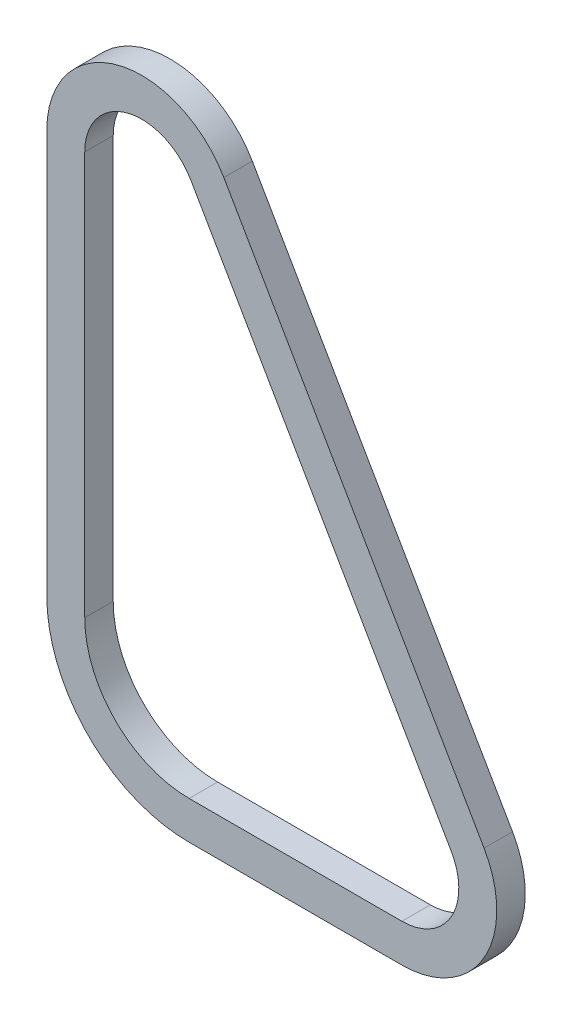
ISO-10303-21;
HEADER;
FILE_DESCRIPTION(('STEP AP214'),'2;1');
FILE_NAME('part.step','',(''),(''),'','','');
FILE_SCHEMA(('AUTOMOTIVE_DESIGN { 1 0 10303 214 1 1 1 1 }'));
ENDSEC;
DATA;
#1=APPLICATION_CONTEXT('core data for automotive mechanical design processes');
#2=APPLICATION_PROTOCOL_DEFINITION('international standard','automotive_design',2000,#1);
#3=PRODUCT_CONTEXT('',#1,'mechanical');
#4=PRODUCT('Part','Part','',(#3));
#5=PRODUCT_RELATED_PRODUCT_CATEGORY('part','',(#4));
#6=PRODUCT_DEFINITION_FORMATION('','',#4);
#7=PRODUCT_DEFINITION_CONTEXT('part definition',#1,'design');
#8=PRODUCT_DEFINITION('design','',#6,#7);
#9=PRODUCT_DEFINITION_SHAPE('','',#8);
#10=(LENGTH_UNIT() NAMED_UNIT(*) SI_UNIT(.MILLI.,.METRE.));
#11=(NAMED_UNIT(*) PLANE_ANGLE_UNIT() SI_UNIT($,.RADIAN.));
#12=(NAMED_UNIT(*) SI_UNIT($,.STERADIAN.) SOLID_ANGLE_UNIT());
#13=UNCERTAINTY_MEASURE_WITH_UNIT(LENGTH_MEASURE(1.E-05),#10,'distance_accuracy_value','');
#14=(GEOMETRIC_REPRESENTATION_CONTEXT(3) GLOBAL_UNCERTAINTY_ASSIGNED_CONTEXT((#13)) GLOBAL_UNIT_ASSIGNED_CONTEXT((#10,
#11,#12)) REPRESENTATION_CONTEXT('',''));
#15=CARTESIAN_POINT('',(0.,0.,0.));
#16=DIRECTION('',(0.,0.,1.));
#17=DIRECTION('',(1.,0.,0.));
#18=AXIS2_PLACEMENT_3D('',#15,#16,#17);
#19=CARTESIAN_POINT('',(-50.,0.,-30.));
#20=DIRECTION('',(-1.,0.,0.));
#21=DIRECTION('',(0.,-1.,0.));
#22=AXIS2_PLACEMENT_3D('',#19,#20,#21);
#23=PLANE('',#22);
#24=DIRECTION('',(0.,1.,0.));
#25=VECTOR('',#24,1.);
#26=CARTESIAN_POINT('',(-50.,0.,0.));
#27=LINE('',#26,#25);
#28=CARTESIAN_POINT('',(-50.,-425.,0.));
#29=VERTEX_POINT('',#28);
#30=CARTESIAN_POINT('',(-50.,0.,0.));
#31=VERTEX_POINT('',#30);
#32=EDGE_CURVE('E179',#29,#31,#27,.T.);
#33=ORIENTED_EDGE('',*,*,#32,.T.);
#34=DIRECTION('',(0.,0.,1.));
#35=VECTOR('',#34,1.);
#36=CARTESIAN_POINT('',(-50.,0.,-30.));
#37=LINE('',#36,#35);
#38=CARTESIAN_POINT('',(-50.,0.,-30.));
#39=VERTEX_POINT('',#38);
#40=EDGE_CURVE('E192',#39,#31,#37,.T.);
#41=ORIENTED_EDGE('',*,*,#40,.F.);
#42=DIRECTION('',(0.,1.,0.));
#43=VECTOR('',#42,1.);
#44=CARTESIAN_POINT('',(-50.,0.,-30.));
#45=LINE('',#44,#43);
#46=CARTESIAN_POINT('',(-50.,-425.,-30.));
#47=VERTEX_POINT('',#46);
#48=EDGE_CURVE('E224',#47,#39,#45,.T.);
#49=ORIENTED_EDGE('',*,*,#48,.F.);
#50=DIRECTION('',(0.,0.,1.));
#51=VECTOR('',#50,1.);
#52=CARTESIAN_POINT('',(-50.,-425.,-30.));
#53=LINE('',#52,#51);
#54=EDGE_CURVE('E11',#47,#29,#53,.T.);
#55=ORIENTED_EDGE('',*,*,#54,.T.);
#56=EDGE_LOOP('',(#33,#41,#49,#55));
#57=FACE_BOUND('',#56,.T.);
#58=ADVANCED_FACE('F37',(#57),#23,.T.);
#59=CARTESIAN_POINT('',(100.,-425.,-30.));
#60=DIRECTION('',(0.,0.,1.));
#61=DIRECTION('',(-1.,0.,0.));
#62=AXIS2_PLACEMENT_3D('',#59,#60,#61);
#63=CYLINDRICAL_SURFACE('',#62,150.);
#64=CARTESIAN_POINT('',(100.,-425.,0.));
#65=DIRECTION('',(0.,0.,1.));
#66=DIRECTION('',(1.,0.,0.));
#67=AXIS2_PLACEMENT_3D('',#64,#65,#66);
#68=CIRCLE('',#67,150.);
#69=CARTESIAN_POINT('',(100.,-575.,0.));
#70=VERTEX_POINT('',#69);
#71=EDGE_CURVE('E182',#29,#70,#68,.T.);
#72=ORIENTED_EDGE('',*,*,#71,.F.);
#73=ORIENTED_EDGE('',*,*,#54,.F.);
#74=CARTESIAN_POINT('',(100.,-425.,-30.));
#75=DIRECTION('',(0.,0.,1.));
#76=DIRECTION('',(1.,0.,0.));
#77=AXIS2_PLACEMENT_3D('',#74,#75,#76);
#78=CIRCLE('',#77,150.);
#79=CARTESIAN_POINT('',(100.,-575.,-30.));
#80=VERTEX_POINT('',#79);
#81=EDGE_CURVE('E156',#47,#80,#78,.T.);
#82=ORIENTED_EDGE('',*,*,#81,.T.);
#83=DIRECTION('',(0.,0.,1.));
#84=VECTOR('',#83,1.);
#85=CARTESIAN_POINT('',(100.,-575.,-30.));
#86=LINE('',#85,#84);
#87=EDGE_CURVE('E47',#80,#70,#86,.T.);
#88=ORIENTED_EDGE('',*,*,#87,.T.);
#89=EDGE_LOOP('',(#72,#73,#82,#88));
#90=FACE_BOUND('',#89,.T.);
#91=ADVANCED_FACE('F240',(#90),#63,.T.);
#92=CARTESIAN_POINT('',(0.,-575.,-30.));
#93=DIRECTION('',(0.,-1.,0.));
#94=DIRECTION('',(0.,0.,1.));
#95=AXIS2_PLACEMENT_3D('',#92,#93,#94);
#96=PLANE('',#95);
#97=DIRECTION('',(-1.,0.,0.));
#98=VECTOR('',#97,1.);
#99=CARTESIAN_POINT('',(0.,-575.,0.));
#100=LINE('',#99,#98);
#101=CARTESIAN_POINT('',(324.241377865075,-575.,0.));
#102=VERTEX_POINT('',#101);
#103=EDGE_CURVE('E185',#102,#70,#100,.T.);
#104=ORIENTED_EDGE('',*,*,#103,.T.);
#105=ORIENTED_EDGE('',*,*,#87,.F.);
#106=DIRECTION('',(-1.,0.,0.));
#107=VECTOR('',#106,1.);
#108=CARTESIAN_POINT('',(0.,-575.,-30.));
#109=LINE('',#108,#107);
#110=CARTESIAN_POINT('',(324.241377865075,-575.,-30.));
#111=VERTEX_POINT('',#110);
#112=EDGE_CURVE('E154',#111,#80,#109,.T.);
#113=ORIENTED_EDGE('',*,*,#112,.F.);
#114=DIRECTION('',(0.,0.,1.));
#115=VECTOR('',#114,1.);
#116=CARTESIAN_POINT('',(324.241377865075,-575.,-30.));
#117=LINE('',#116,#115);
#118=EDGE_CURVE('E148',#111,#102,#117,.T.);
#119=ORIENTED_EDGE('',*,*,#118,.T.);
#120=EDGE_LOOP('',(#104,#105,#113,#119));
#121=FACE_BOUND('',#120,.T.);
#122=ADVANCED_FACE('F245',(#121),#96,.T.);
#123=CARTESIAN_POINT('',(324.241377865075,-475.,-30.));
#124=DIRECTION('',(0.,0.,1.));
#125=DIRECTION('',(-1.,0.,0.));
#126=AXIS2_PLACEMENT_3D('',#123,#124,#125);
#127=CYLINDRICAL_SURFACE('',#126,100.);
#128=CARTESIAN_POINT('',(324.241377865075,-475.,0.));
#129=DIRECTION('',(0.,0.,1.));
#130=DIRECTION('',(1.,0.,0.));
#131=AXIS2_PLACEMENT_3D('',#128,#129,#130);
#132=CIRCLE('',#131,100.);
#133=CARTESIAN_POINT('',(410.843918243519,-424.999999999999,0.));
#134=VERTEX_POINT('',#133);
#135=EDGE_CURVE('E187',#134,#102,#132,.F.);
#136=ORIENTED_EDGE('',*,*,#135,.T.);
#137=ORIENTED_EDGE('',*,*,#118,.F.);
#138=CARTESIAN_POINT('',(324.241377865075,-475.,-30.));
#139=DIRECTION('',(0.,0.,1.));
#140=DIRECTION('',(1.,0.,0.));
#141=AXIS2_PLACEMENT_3D('',#138,#139,#140);
#142=CIRCLE('',#141,100.);
#143=CARTESIAN_POINT('',(410.843918243519,-424.999999999999,-30.));
#144=VERTEX_POINT('',#143);
#145=EDGE_CURVE('E138',#144,#111,#142,.F.);
#146=ORIENTED_EDGE('',*,*,#145,.F.);
#147=DIRECTION('',(0.,0.,1.));
#148=VECTOR('',#147,1.);
#149=CARTESIAN_POINT('',(410.843918243519,-424.999999999999,-30.));
#150=LINE('',#149,#148);
#151=EDGE_CURVE('E143',#144,#134,#150,.T.);
#152=ORIENTED_EDGE('',*,*,#151,.T.);
#153=EDGE_LOOP('',(#136,#137,#146,#152));
#154=FACE_BOUND('',#153,.T.);
#155=ADVANCED_FACE('F151',(#154),#127,.T.);
#156=CARTESIAN_POINT('',(124.102540378443,71.6506350946115,-30.));
#157=DIRECTION('',(0.866025403784436,0.500000000000004,0.));
#158=DIRECTION('',(-0.500000000000004,0.866025403784436,0.));
#159=AXIS2_PLACEMENT_3D('',#156,#157,#158);
#160=PLANE('',#159);
#161=DIRECTION('',(0.500000000000005,-0.866025403784436,0.));
#162=VECTOR('',#161,1.);
#163=CARTESIAN_POINT('',(124.102540378443,71.6506350946115,0.));
#164=LINE('',#163,#162);
#165=CARTESIAN_POINT('',(136.602540378444,50.0000000000004,0.));
#166=VERTEX_POINT('',#165);
#167=EDGE_CURVE('E145',#166,#134,#164,.T.);
#168=ORIENTED_EDGE('',*,*,#167,.T.);
#169=ORIENTED_EDGE('',*,*,#151,.F.);
#170=DIRECTION('',(0.500000000000005,-0.866025403784436,0.));
#171=VECTOR('',#170,1.);
#172=CARTESIAN_POINT('',(124.102540378443,71.6506350946115,-30.));
#173=LINE('',#172,#171);
#174=CARTESIAN_POINT('',(136.602540378444,50.0000000000004,-30.));
#175=VERTEX_POINT('',#174);
#176=EDGE_CURVE('E134',#175,#144,#173,.T.);
#177=ORIENTED_EDGE('',*,*,#176,.F.);
#178=DIRECTION('',(0.,0.,1.));
#179=VECTOR('',#178,1.);
#180=CARTESIAN_POINT('',(136.602540378444,50.0000000000004,-30.));
#181=LINE('',#180,#179);
#182=EDGE_CURVE('E149',#175,#166,#181,.T.);
#183=ORIENTED_EDGE('',*,*,#182,.T.);
#184=EDGE_LOOP('',(#168,#169,#177,#183));
#185=FACE_BOUND('',#184,.T.);
#186=ADVANCED_FACE('F144',(#185),#160,.T.);
#187=CARTESIAN_POINT('',(-10.,0.,-30.));
#188=DIRECTION('',(-1.,0.,0.));
#189=DIRECTION('',(0.,-1.,0.));
#190=AXIS2_PLACEMENT_3D('',#187,#188,#189);
#191=PLANE('',#190);
#192=DIRECTION('',(0.,1.,0.));
#193=VECTOR('',#192,1.);
#194=CARTESIAN_POINT('',(-10.,0.,0.));
#195=LINE('',#194,#193);
#196=CARTESIAN_POINT('',(-9.99999999999998,-425.,0.));
#197=VERTEX_POINT('',#196);
#198=CARTESIAN_POINT('',(-10.,0.,0.));
#199=VERTEX_POINT('',#198);
#200=EDGE_CURVE('E162',#197,#199,#195,.T.);
#201=ORIENTED_EDGE('',*,*,#200,.F.);
#202=DIRECTION('',(0.,0.,1.));
#203=VECTOR('',#202,1.);
#204=CARTESIAN_POINT('',(-9.99999999999998,-425.,-30.));
#205=LINE('',#204,#203);
#206=CARTESIAN_POINT('',(-9.99999999999998,-425.,-30.));
#207=VERTEX_POINT('',#206);
#208=EDGE_CURVE('E161',#207,#197,#205,.T.);
#209=ORIENTED_EDGE('',*,*,#208,.F.);
#210=DIRECTION('',(0.,1.,0.));
#211=VECTOR('',#210,1.);
#212=CARTESIAN_POINT('',(-10.,0.,-30.));
#213=LINE('',#212,#211);
#214=CARTESIAN_POINT('',(-10.,0.,-30.));
#215=VERTEX_POINT('',#214);
#216=EDGE_CURVE('E191',#207,#215,#213,.T.);
#217=ORIENTED_EDGE('',*,*,#216,.T.);
#218=DIRECTION('',(0.,0.,1.));
#219=VECTOR('',#218,1.);
#220=CARTESIAN_POINT('',(-10.,0.,-30.));
#221=LINE('',#220,#219);
#222=EDGE_CURVE('E41',#215,#199,#221,.T.);
#223=ORIENTED_EDGE('',*,*,#222,.T.);
#224=EDGE_LOOP('',(#201,#209,#217,#223));
#225=FACE_BOUND('',#224,.T.);
#226=ADVANCED_FACE('F39',(#225),#191,.F.);
#227=CARTESIAN_POINT('',(50.,0.,-30.));
#228=DIRECTION('',(0.,0.,1.));
#229=DIRECTION('',(-1.,0.,0.));
#230=AXIS2_PLACEMENT_3D('',#227,#228,#229);
#231=CYLINDRICAL_SURFACE('',#230,60.);
#232=CARTESIAN_POINT('',(50.,0.,0.));
#233=DIRECTION('',(0.,0.,1.));
#234=DIRECTION('',(1.,0.,0.));
#235=AXIS2_PLACEMENT_3D('',#232,#233,#234);
#236=CIRCLE('',#235,60.);
#237=CARTESIAN_POINT('',(101.961524227066,30.0000000000003,0.));
#238=VERTEX_POINT('',#237);
#239=EDGE_CURVE('E165',#199,#238,#236,.F.);
#240=ORIENTED_EDGE('',*,*,#239,.F.);
#241=ORIENTED_EDGE('',*,*,#222,.F.);
#242=CARTESIAN_POINT('',(50.,0.,-30.));
#243=DIRECTION('',(0.,0.,1.));
#244=DIRECTION('',(1.,0.,0.));
#245=AXIS2_PLACEMENT_3D('',#242,#243,#244);
#246=CIRCLE('',#245,60.);
#247=CARTESIAN_POINT('',(101.961524227066,30.0000000000003,-30.));
#248=VERTEX_POINT('',#247);
#249=EDGE_CURVE('E107',#215,#248,#246,.F.);
#250=ORIENTED_EDGE('',*,*,#249,.T.);
#251=DIRECTION('',(0.,0.,1.));
#252=VECTOR('',#251,1.);
#253=CARTESIAN_POINT('',(101.961524227066,30.0000000000003,-30.));
#254=LINE('',#253,#252);
#255=EDGE_CURVE('E208',#248,#238,#254,.T.);
#256=ORIENTED_EDGE('',*,*,#255,.T.);
#257=EDGE_LOOP('',(#240,#241,#250,#256));
#258=FACE_BOUND('',#257,.T.);
#259=ADVANCED_FACE('F277',(#258),#231,.F.);
#260=CARTESIAN_POINT('',(89.4615242270663,51.650635094611,-30.));
#261=DIRECTION('',(0.866025403784439,0.5,0.));
#262=DIRECTION('',(-0.5,0.866025403784439,0.));
#263=AXIS2_PLACEMENT_3D('',#260,#261,#262);
#264=PLANE('',#263);
#265=DIRECTION('',(0.5,-0.866025403784439,0.));
#266=VECTOR('',#265,1.);
#267=CARTESIAN_POINT('',(89.4615242270663,51.650635094611,0.));
#268=LINE('',#267,#266);
#269=CARTESIAN_POINT('',(376.202902092139,-445.000000000001,0.));
#270=VERTEX_POINT('',#269);
#271=EDGE_CURVE('E168',#238,#270,#268,.T.);
#272=ORIENTED_EDGE('',*,*,#271,.F.);
#273=ORIENTED_EDGE('',*,*,#255,.F.);
#274=DIRECTION('',(0.5,-0.866025403784439,0.));
#275=VECTOR('',#274,1.);
#276=CARTESIAN_POINT('',(89.4615242270663,51.650635094611,-30.));
#277=LINE('',#276,#275);
#278=CARTESIAN_POINT('',(376.202902092139,-445.000000000001,-30.));
#279=VERTEX_POINT('',#278);
#280=EDGE_CURVE('E228',#248,#279,#277,.T.);
#281=ORIENTED_EDGE('',*,*,#280,.T.);
#282=DIRECTION('',(0.,0.,1.));
#283=VECTOR('',#282,1.);
#284=CARTESIAN_POINT('',(376.202902092139,-445.000000000001,-30.));
#285=LINE('',#284,#283);
#286=EDGE_CURVE('E206',#279,#270,#285,.T.);
#287=ORIENTED_EDGE('',*,*,#286,.T.);
#288=EDGE_LOOP('',(#272,#273,#281,#287));
#289=FACE_BOUND('',#288,.T.);
#290=ADVANCED_FACE('F274',(#289),#264,.F.);
#291=CARTESIAN_POINT('',(324.241377865075,-475.,-30.));
#292=DIRECTION('',(0.,0.,1.));
#293=DIRECTION('',(-1.,0.,0.));
#294=AXIS2_PLACEMENT_3D('',#291,#292,#293);
#295=CYLINDRICAL_SURFACE('',#294,59.9999999999987);
#296=CARTESIAN_POINT('',(324.241377865075,-475.,0.));
#297=DIRECTION('',(0.,0.,1.));
#298=DIRECTION('',(1.,0.,0.));
#299=AXIS2_PLACEMENT_3D('',#296,#297,#298);
#300=CIRCLE('',#299,59.9999999999987);
#301=CARTESIAN_POINT('',(324.241377865075,-535.,0.));
#302=VERTEX_POINT('',#301);
#303=EDGE_CURVE('E171',#270,#302,#300,.F.);
#304=ORIENTED_EDGE('',*,*,#303,.F.);
#305=ORIENTED_EDGE('',*,*,#286,.F.);
#306=CARTESIAN_POINT('',(324.241377865075,-475.,-30.));
#307=DIRECTION('',(0.,0.,1.));
#308=DIRECTION('',(1.,0.,0.));
#309=AXIS2_PLACEMENT_3D('',#306,#307,#308);
#310=CIRCLE('',#309,59.9999999999987);
#311=CARTESIAN_POINT('',(324.241377865075,-535.,-30.));
#312=VERTEX_POINT('',#311);
#313=EDGE_CURVE('E233',#279,#312,#310,.F.);
#314=ORIENTED_EDGE('',*,*,#313,.T.);
#315=DIRECTION('',(0.,0.,1.));
#316=VECTOR('',#315,1.);
#317=CARTESIAN_POINT('',(324.241377865075,-535.,-30.));
#318=LINE('',#317,#316);
#319=EDGE_CURVE('E203',#312,#302,#318,.T.);
#320=ORIENTED_EDGE('',*,*,#319,.T.);
#321=EDGE_LOOP('',(#304,#305,#314,#320));
#322=FACE_BOUND('',#321,.T.);
#323=ADVANCED_FACE('F270',(#322),#295,.F.);
#324=CARTESIAN_POINT('',(0.,-535.,-30.));
#325=DIRECTION('',(0.,-1.,0.));
#326=DIRECTION('',(0.,0.,1.));
#327=AXIS2_PLACEMENT_3D('',#324,#325,#326);
#328=PLANE('',#327);
#329=DIRECTION('',(-1.,0.,0.));
#330=VECTOR('',#329,1.);
#331=CARTESIAN_POINT('',(0.,-535.,0.));
#332=LINE('',#331,#330);
#333=CARTESIAN_POINT('',(100.,-535.,0.));
#334=VERTEX_POINT('',#333);
#335=EDGE_CURVE('E174',#302,#334,#332,.T.);
#336=ORIENTED_EDGE('',*,*,#335,.F.);
#337=ORIENTED_EDGE('',*,*,#319,.F.);
#338=DIRECTION('',(-1.,0.,0.));
#339=VECTOR('',#338,1.);
#340=CARTESIAN_POINT('',(0.,-535.,-30.));
#341=LINE('',#340,#339);
#342=CARTESIAN_POINT('',(100.,-535.,-30.));
#343=VERTEX_POINT('',#342);
#344=EDGE_CURVE('E225',#312,#343,#341,.T.);
#345=ORIENTED_EDGE('',*,*,#344,.T.);
#346=DIRECTION('',(0.,0.,1.));
#347=VECTOR('',#346,1.);
#348=CARTESIAN_POINT('',(100.,-535.,-30.));
#349=LINE('',#348,#347);
#350=EDGE_CURVE('E200',#343,#334,#349,.T.);
#351=ORIENTED_EDGE('',*,*,#350,.T.);
#352=EDGE_LOOP('',(#336,#337,#345,#351));
#353=FACE_BOUND('',#352,.T.);
#354=ADVANCED_FACE('F256',(#353),#328,.F.);
#355=CARTESIAN_POINT('',(100.,-425.,-30.));
#356=DIRECTION('',(0.,0.,1.));
#357=DIRECTION('',(-1.,0.,0.));
#358=AXIS2_PLACEMENT_3D('',#355,#356,#357);
#359=CYLINDRICAL_SURFACE('',#358,110.);
#360=CARTESIAN_POINT('',(100.,-425.,0.));
#361=DIRECTION('',(0.,0.,1.));
#362=DIRECTION('',(1.,0.,0.));
#363=AXIS2_PLACEMENT_3D('',#360,#361,#362);
#364=CIRCLE('',#363,110.);
#365=EDGE_CURVE('E177',#197,#334,#364,.T.);
#366=ORIENTED_EDGE('',*,*,#365,.T.);
#367=ORIENTED_EDGE('',*,*,#350,.F.);
#368=CARTESIAN_POINT('',(100.,-425.,-30.));
#369=DIRECTION('',(0.,0.,1.));
#370=DIRECTION('',(1.,0.,0.));
#371=AXIS2_PLACEMENT_3D('',#368,#369,#370);
#372=CIRCLE('',#371,110.);
#373=EDGE_CURVE('E222',#207,#343,#372,.T.);
#374=ORIENTED_EDGE('',*,*,#373,.F.);
#375=ORIENTED_EDGE('',*,*,#208,.T.);
#376=EDGE_LOOP('',(#366,#367,#374,#375));
#377=FACE_BOUND('',#376,.T.);
#378=ADVANCED_FACE('F221',(#377),#359,.F.);
#379=CARTESIAN_POINT('',(50.,0.,-30.));
#380=DIRECTION('',(0.,0.,1.));
#381=DIRECTION('',(-1.,0.,0.));
#382=AXIS2_PLACEMENT_3D('',#379,#380,#381);
#383=CYLINDRICAL_SURFACE('',#382,100.);
#384=CARTESIAN_POINT('',(50.,0.,0.));
#385=DIRECTION('',(0.,0.,1.));
#386=DIRECTION('',(1.,0.,0.));
#387=AXIS2_PLACEMENT_3D('',#384,#385,#386);
#388=CIRCLE('',#387,100.);
#389=EDGE_CURVE('E94',#31,#166,#388,.F.);
#390=ORIENTED_EDGE('',*,*,#389,.T.);
#391=ORIENTED_EDGE('',*,*,#182,.F.);
#392=CARTESIAN_POINT('',(50.,0.,-30.));
#393=DIRECTION('',(0.,0.,1.));
#394=DIRECTION('',(1.,0.,0.));
#395=AXIS2_PLACEMENT_3D('',#392,#393,#394);
#396=CIRCLE('',#395,100.);
#397=EDGE_CURVE('E56',#39,#175,#396,.F.);
#398=ORIENTED_EDGE('',*,*,#397,.F.);
#399=ORIENTED_EDGE('',*,*,#40,.T.);
#400=EDGE_LOOP('',(#390,#391,#398,#399));
#401=FACE_BOUND('',#400,.T.);
#402=ADVANCED_FACE('F248',(#401),#383,.T.);
#403=CARTESIAN_POINT('',(0.,0.,-30.));
#404=DIRECTION('',(0.,0.,-1.));
#405=DIRECTION('',(1.,0.,0.));
#406=AXIS2_PLACEMENT_3D('',#403,#404,#405);
#407=PLANE('',#406);
#408=ORIENTED_EDGE('',*,*,#216,.F.);
#409=ORIENTED_EDGE('',*,*,#373,.T.);
#410=ORIENTED_EDGE('',*,*,#344,.F.);
#411=ORIENTED_EDGE('',*,*,#313,.F.);
#412=ORIENTED_EDGE('',*,*,#280,.F.);
#413=ORIENTED_EDGE('',*,*,#249,.F.);
#414=EDGE_LOOP('',(#408,#409,#410,#411,#412,#413));
#415=FACE_BOUND('',#414,.T.);
#416=ORIENTED_EDGE('',*,*,#48,.T.);
#417=ORIENTED_EDGE('',*,*,#397,.T.);
#418=ORIENTED_EDGE('',*,*,#176,.T.);
#419=ORIENTED_EDGE('',*,*,#145,.T.);
#420=ORIENTED_EDGE('',*,*,#112,.T.);
#421=ORIENTED_EDGE('',*,*,#81,.F.);
#422=EDGE_LOOP('',(#416,#417,#418,#419,#420,#421));
#423=FACE_BOUND('',#422,.T.);
#424=ADVANCED_FACE('F136',(#415,#423),#407,.T.);
#425=CARTESIAN_POINT('',(0.,0.,0.));
#426=DIRECTION('',(0.,0.,-1.));
#427=DIRECTION('',(1.,0.,0.));
#428=AXIS2_PLACEMENT_3D('',#425,#426,#427);
#429=PLANE('',#428);
#430=ORIENTED_EDGE('',*,*,#200,.T.);
#431=ORIENTED_EDGE('',*,*,#239,.T.);
#432=ORIENTED_EDGE('',*,*,#271,.T.);
#433=ORIENTED_EDGE('',*,*,#303,.T.);
#434=ORIENTED_EDGE('',*,*,#335,.T.);
#435=ORIENTED_EDGE('',*,*,#365,.F.);
#436=EDGE_LOOP('',(#430,#431,#432,#433,#434,#435));
#437=FACE_BOUND('',#436,.T.);
#438=ORIENTED_EDGE('',*,*,#32,.F.);
#439=ORIENTED_EDGE('',*,*,#71,.T.);
#440=ORIENTED_EDGE('',*,*,#103,.F.);
#441=ORIENTED_EDGE('',*,*,#135,.F.);
#442=ORIENTED_EDGE('',*,*,#167,.F.);
#443=ORIENTED_EDGE('',*,*,#389,.F.);
#444=EDGE_LOOP('',(#438,#439,#440,#441,#442,#443));
#445=FACE_BOUND('',#444,.T.);
#446=ADVANCED_FACE('F218',(#437,#445),#429,.F.);
#447=CLOSED_SHELL('',(#58,#91,#122,#155,#186,#226,#259,#290,#323,#354,#378,#402,#424,#446));
#448=MANIFOLD_SOLID_BREP('B2',#447);
#449=ADVANCED_BREP_SHAPE_REPRESENTATION('',(#18,#448),#14);
#450=SHAPE_DEFINITION_REPRESENTATION(#9,#449);
ENDSEC;
END-ISO-10303-21;
